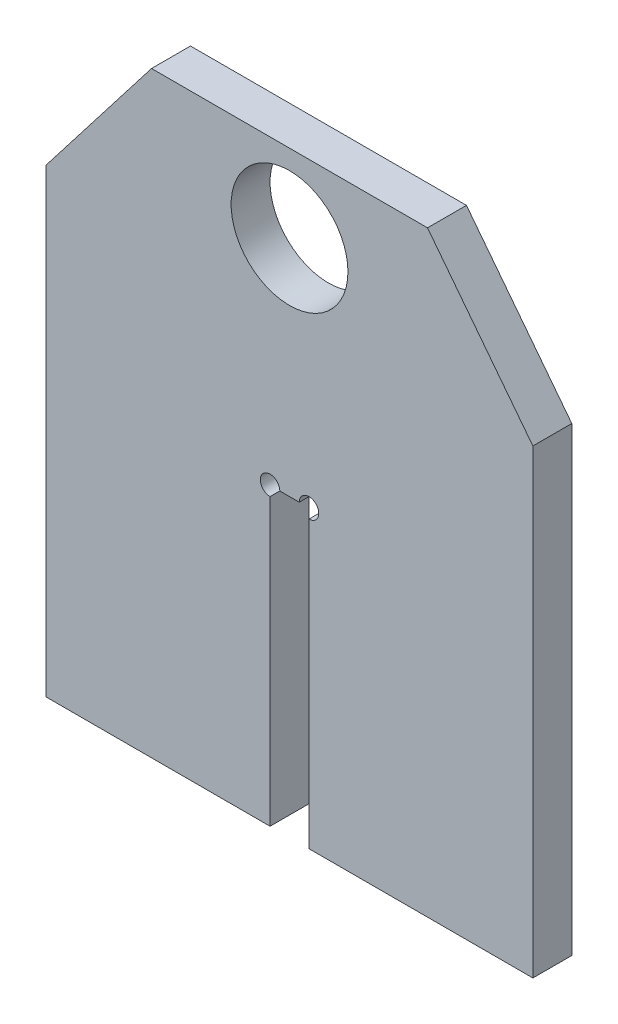
ISO-10303-21;
HEADER;
FILE_DESCRIPTION(('STEP AP214'),'2;1');
FILE_NAME('part.step','',(''),(''),'','','');
FILE_SCHEMA(('AUTOMOTIVE_DESIGN { 1 0 10303 214 1 1 1 1 }'));
ENDSEC;
DATA;
#1=APPLICATION_CONTEXT('core data for automotive mechanical design processes');
#2=APPLICATION_PROTOCOL_DEFINITION('international standard','automotive_design',2000,#1);
#3=PRODUCT_CONTEXT('',#1,'mechanical');
#4=PRODUCT('Part','Part','',(#3));
#5=PRODUCT_RELATED_PRODUCT_CATEGORY('part','',(#4));
#6=PRODUCT_DEFINITION_FORMATION('','',#4);
#7=PRODUCT_DEFINITION_CONTEXT('part definition',#1,'design');
#8=PRODUCT_DEFINITION('design','',#6,#7);
#9=PRODUCT_DEFINITION_SHAPE('','',#8);
#10=(LENGTH_UNIT() NAMED_UNIT(*) SI_UNIT(.MILLI.,.METRE.));
#11=(NAMED_UNIT(*) PLANE_ANGLE_UNIT() SI_UNIT($,.RADIAN.));
#12=(NAMED_UNIT(*) SI_UNIT($,.STERADIAN.) SOLID_ANGLE_UNIT());
#13=UNCERTAINTY_MEASURE_WITH_UNIT(LENGTH_MEASURE(1.E-05),#10,'distance_accuracy_value','');
#14=(GEOMETRIC_REPRESENTATION_CONTEXT(3) GLOBAL_UNCERTAINTY_ASSIGNED_CONTEXT((#13)) GLOBAL_UNIT_ASSIGNED_CONTEXT((#10,
#11,#12)) REPRESENTATION_CONTEXT('',''));
#15=CARTESIAN_POINT('',(0.,0.,0.));
#16=DIRECTION('',(0.,0.,1.));
#17=DIRECTION('',(1.,0.,0.));
#18=AXIS2_PLACEMENT_3D('',#15,#16,#17);
#19=CARTESIAN_POINT('',(-3.,-34.5,6.));
#20=DIRECTION('',(0.,0.,1.));
#21=DIRECTION('',(1.,0.,0.));
#22=AXIS2_PLACEMENT_3D('',#19,#20,#21);
#23=PLANE('',#22);
#24=DIRECTION('',(1.,0.,0.));
#25=VECTOR('',#24,1.);
#26=CARTESIAN_POINT('',(3.00000000000002,-80.,6.));
#27=LINE('',#26,#25);
#28=CARTESIAN_POINT('',(3.00000000000002,-80.,6.));
#29=VERTEX_POINT('',#28);
#30=CARTESIAN_POINT('',(37.5,-80.,6.));
#31=VERTEX_POINT('',#30);
#32=EDGE_CURVE('E177',#29,#31,#27,.T.);
#33=ORIENTED_EDGE('',*,*,#32,.T.);
#34=DIRECTION('',(0.,1.,0.));
#35=VECTOR('',#34,1.);
#36=CARTESIAN_POINT('',(37.5,-9.,6.));
#37=LINE('',#36,#35);
#38=CARTESIAN_POINT('',(37.5,-9.,6.));
#39=VERTEX_POINT('',#38);
#40=EDGE_CURVE('E105',#31,#39,#37,.T.);
#41=ORIENTED_EDGE('',*,*,#40,.T.);
#42=DIRECTION('',(-0.611618619682889,0.791152743822075,0.));
#43=VECTOR('',#42,1.);
#44=CARTESIAN_POINT('',(37.5,-9.,6.));
#45=LINE('',#44,#43);
#46=CARTESIAN_POINT('',(21.265472453156,12.,6.));
#47=VERTEX_POINT('',#46);
#48=EDGE_CURVE('E204',#39,#47,#45,.T.);
#49=ORIENTED_EDGE('',*,*,#48,.T.);
#50=DIRECTION('',(-1.,0.,0.));
#51=VECTOR('',#50,1.);
#52=CARTESIAN_POINT('',(-21.265472453156,12.,6.));
#53=LINE('',#52,#51);
#54=CARTESIAN_POINT('',(-21.265472453156,12.,6.));
#55=VERTEX_POINT('',#54);
#56=EDGE_CURVE('E223',#47,#55,#53,.T.);
#57=ORIENTED_EDGE('',*,*,#56,.T.);
#58=DIRECTION('',(-0.611618619682889,-0.791152743822075,0.));
#59=VECTOR('',#58,1.);
#60=CARTESIAN_POINT('',(-37.5,-9.00000000000001,6.));
#61=LINE('',#60,#59);
#62=CARTESIAN_POINT('',(-37.5,-9.00000000000001,6.));
#63=VERTEX_POINT('',#62);
#64=EDGE_CURVE('E220',#55,#63,#61,.T.);
#65=ORIENTED_EDGE('',*,*,#64,.T.);
#66=DIRECTION('',(0.,-1.,0.));
#67=VECTOR('',#66,1.);
#68=CARTESIAN_POINT('',(-37.5,-9.00000000000001,6.));
#69=LINE('',#68,#67);
#70=CARTESIAN_POINT('',(-37.5,-80.,6.));
#71=VERTEX_POINT('',#70);
#72=EDGE_CURVE('E222',#63,#71,#69,.T.);
#73=ORIENTED_EDGE('',*,*,#72,.T.);
#74=DIRECTION('',(1.,0.,0.));
#75=VECTOR('',#74,1.);
#76=CARTESIAN_POINT('',(-37.5,-80.,6.));
#77=LINE('',#76,#75);
#78=CARTESIAN_POINT('',(-3.,-80.,6.));
#79=VERTEX_POINT('',#78);
#80=EDGE_CURVE('E225',#71,#79,#77,.T.);
#81=ORIENTED_EDGE('',*,*,#80,.T.);
#82=DIRECTION('',(0.,1.,0.));
#83=VECTOR('',#82,1.);
#84=CARTESIAN_POINT('',(-3.,-80.,6.));
#85=LINE('',#84,#83);
#86=CARTESIAN_POINT('',(-3.,-36.,6.));
#87=VERTEX_POINT('',#86);
#88=EDGE_CURVE('E231',#79,#87,#85,.T.);
#89=ORIENTED_EDGE('',*,*,#88,.T.);
#90=CARTESIAN_POINT('',(-3.,-34.5,6.));
#91=DIRECTION('',(0.,0.,-1.));
#92=DIRECTION('',(1.,0.,0.));
#93=AXIS2_PLACEMENT_3D('',#90,#91,#92);
#94=CIRCLE('',#93,1.5);
#95=CARTESIAN_POINT('',(-1.5,-34.5,6.));
#96=VERTEX_POINT('',#95);
#97=EDGE_CURVE('E136',#87,#96,#94,.T.);
#98=ORIENTED_EDGE('',*,*,#97,.T.);
#99=DIRECTION('',(1.,0.,0.));
#100=VECTOR('',#99,1.);
#101=CARTESIAN_POINT('',(1.5,-34.5,6.));
#102=LINE('',#101,#100);
#103=CARTESIAN_POINT('',(1.5,-34.5,6.));
#104=VERTEX_POINT('',#103);
#105=EDGE_CURVE('E130',#96,#104,#102,.T.);
#106=ORIENTED_EDGE('',*,*,#105,.T.);
#107=CARTESIAN_POINT('',(3.,-34.5,6.));
#108=DIRECTION('',(0.,0.,-1.));
#109=DIRECTION('',(1.,0.,0.));
#110=AXIS2_PLACEMENT_3D('',#107,#108,#109);
#111=CIRCLE('',#110,1.5);
#112=CARTESIAN_POINT('',(3.,-36.,6.));
#113=VERTEX_POINT('',#112);
#114=EDGE_CURVE('E134',#104,#113,#111,.T.);
#115=ORIENTED_EDGE('',*,*,#114,.T.);
#116=DIRECTION('',(0.,-1.,0.));
#117=VECTOR('',#116,1.);
#118=CARTESIAN_POINT('',(3.00000000000002,-80.,6.));
#119=LINE('',#118,#117);
#120=EDGE_CURVE('E50',#113,#29,#119,.T.);
#121=ORIENTED_EDGE('',*,*,#120,.T.);
#122=EDGE_LOOP('',(#33,#41,#49,#57,#65,#73,#81,#89,#98,#106,#115,#121));
#123=FACE_BOUND('',#122,.T.);
#124=CARTESIAN_POINT('',(0.,0.,6.));
#125=DIRECTION('',(0.,0.,1.));
#126=DIRECTION('',(1.,0.,0.));
#127=AXIS2_PLACEMENT_3D('',#124,#125,#126);
#128=CIRCLE('',#127,9.);
#129=CARTESIAN_POINT('',(9.,0.,6.));
#130=VERTEX_POINT('',#129);
#131=EDGE_CURVE('E158',#130,#130,#128,.T.);
#132=ORIENTED_EDGE('',*,*,#131,.F.);
#133=EDGE_LOOP('',(#132));
#134=FACE_BOUND('',#133,.T.);
#135=ADVANCED_FACE('F33',(#123,#134),#23,.T.);
#136=CARTESIAN_POINT('',(-3.,-34.5,0.));
#137=DIRECTION('',(0.,0.,1.));
#138=DIRECTION('',(1.,0.,0.));
#139=AXIS2_PLACEMENT_3D('',#136,#137,#138);
#140=PLANE('',#139);
#141=DIRECTION('',(1.,0.,0.));
#142=VECTOR('',#141,1.);
#143=CARTESIAN_POINT('',(3.00000000000002,-80.,0.));
#144=LINE('',#143,#142);
#145=CARTESIAN_POINT('',(3.00000000000002,-80.,0.));
#146=VERTEX_POINT('',#145);
#147=CARTESIAN_POINT('',(37.5,-80.,0.));
#148=VERTEX_POINT('',#147);
#149=EDGE_CURVE('E154',#146,#148,#144,.T.);
#150=ORIENTED_EDGE('',*,*,#149,.F.);
#151=DIRECTION('',(0.,-1.,0.));
#152=VECTOR('',#151,1.);
#153=CARTESIAN_POINT('',(3.00000000000002,-80.,0.));
#154=LINE('',#153,#152);
#155=CARTESIAN_POINT('',(3.,-36.,0.));
#156=VERTEX_POINT('',#155);
#157=EDGE_CURVE('E97',#156,#146,#154,.T.);
#158=ORIENTED_EDGE('',*,*,#157,.F.);
#159=CARTESIAN_POINT('',(3.,-34.5,0.));
#160=DIRECTION('',(0.,0.,-1.));
#161=DIRECTION('',(1.,0.,0.));
#162=AXIS2_PLACEMENT_3D('',#159,#160,#161);
#163=CIRCLE('',#162,1.5);
#164=CARTESIAN_POINT('',(1.5,-34.5,0.));
#165=VERTEX_POINT('',#164);
#166=EDGE_CURVE('E91',#165,#156,#163,.T.);
#167=ORIENTED_EDGE('',*,*,#166,.F.);
#168=DIRECTION('',(1.,0.,0.));
#169=VECTOR('',#168,1.);
#170=CARTESIAN_POINT('',(1.5,-34.5,0.));
#171=LINE('',#170,#169);
#172=CARTESIAN_POINT('',(-1.5,-34.5,0.));
#173=VERTEX_POINT('',#172);
#174=EDGE_CURVE('E144',#173,#165,#171,.T.);
#175=ORIENTED_EDGE('',*,*,#174,.F.);
#176=CARTESIAN_POINT('',(-3.,-34.5,0.));
#177=DIRECTION('',(0.,0.,-1.));
#178=DIRECTION('',(1.,0.,0.));
#179=AXIS2_PLACEMENT_3D('',#176,#177,#178);
#180=CIRCLE('',#179,1.5);
#181=CARTESIAN_POINT('',(-3.,-36.,0.));
#182=VERTEX_POINT('',#181);
#183=EDGE_CURVE('E172',#182,#173,#180,.T.);
#184=ORIENTED_EDGE('',*,*,#183,.F.);
#185=DIRECTION('',(0.,1.,0.));
#186=VECTOR('',#185,1.);
#187=CARTESIAN_POINT('',(-3.,-80.,0.));
#188=LINE('',#187,#186);
#189=CARTESIAN_POINT('',(-3.,-80.,0.));
#190=VERTEX_POINT('',#189);
#191=EDGE_CURVE('E170',#190,#182,#188,.T.);
#192=ORIENTED_EDGE('',*,*,#191,.F.);
#193=DIRECTION('',(1.,0.,0.));
#194=VECTOR('',#193,1.);
#195=CARTESIAN_POINT('',(-37.5,-80.,0.));
#196=LINE('',#195,#194);
#197=CARTESIAN_POINT('',(-37.5,-80.,0.));
#198=VERTEX_POINT('',#197);
#199=EDGE_CURVE('E168',#198,#190,#196,.T.);
#200=ORIENTED_EDGE('',*,*,#199,.F.);
#201=DIRECTION('',(0.,-1.,0.));
#202=VECTOR('',#201,1.);
#203=CARTESIAN_POINT('',(-37.5,-9.00000000000001,0.));
#204=LINE('',#203,#202);
#205=CARTESIAN_POINT('',(-37.5,-9.00000000000001,0.));
#206=VERTEX_POINT('',#205);
#207=EDGE_CURVE('E166',#206,#198,#204,.T.);
#208=ORIENTED_EDGE('',*,*,#207,.F.);
#209=DIRECTION('',(-0.611618619682889,-0.791152743822075,0.));
#210=VECTOR('',#209,1.);
#211=CARTESIAN_POINT('',(-37.5,-9.00000000000001,0.));
#212=LINE('',#211,#210);
#213=CARTESIAN_POINT('',(-21.265472453156,12.,0.));
#214=VERTEX_POINT('',#213);
#215=EDGE_CURVE('E164',#214,#206,#212,.T.);
#216=ORIENTED_EDGE('',*,*,#215,.F.);
#217=DIRECTION('',(-1.,0.,0.));
#218=VECTOR('',#217,1.);
#219=CARTESIAN_POINT('',(-21.265472453156,12.,0.));
#220=LINE('',#219,#218);
#221=CARTESIAN_POINT('',(21.265472453156,12.,0.));
#222=VERTEX_POINT('',#221);
#223=EDGE_CURVE('E162',#222,#214,#220,.T.);
#224=ORIENTED_EDGE('',*,*,#223,.F.);
#225=DIRECTION('',(-0.611618619682889,0.791152743822075,0.));
#226=VECTOR('',#225,1.);
#227=CARTESIAN_POINT('',(37.5,-9.,0.));
#228=LINE('',#227,#226);
#229=CARTESIAN_POINT('',(37.5,-9.,0.));
#230=VERTEX_POINT('',#229);
#231=EDGE_CURVE('E160',#230,#222,#228,.T.);
#232=ORIENTED_EDGE('',*,*,#231,.F.);
#233=DIRECTION('',(0.,1.,0.));
#234=VECTOR('',#233,1.);
#235=CARTESIAN_POINT('',(37.5,-9.,0.));
#236=LINE('',#235,#234);
#237=EDGE_CURVE('E157',#148,#230,#236,.T.);
#238=ORIENTED_EDGE('',*,*,#237,.F.);
#239=EDGE_LOOP('',(#150,#158,#167,#175,#184,#192,#200,#208,#216,#224,#232,#238));
#240=FACE_BOUND('',#239,.T.);
#241=CARTESIAN_POINT('',(0.,0.,0.));
#242=DIRECTION('',(0.,0.,1.));
#243=DIRECTION('',(1.,0.,0.));
#244=AXIS2_PLACEMENT_3D('',#241,#242,#243);
#245=CIRCLE('',#244,9.);
#246=CARTESIAN_POINT('',(9.,0.,0.));
#247=VERTEX_POINT('',#246);
#248=EDGE_CURVE('E378',#247,#247,#245,.T.);
#249=ORIENTED_EDGE('',*,*,#248,.T.);
#250=EDGE_LOOP('',(#249));
#251=FACE_BOUND('',#250,.T.);
#252=ADVANCED_FACE('F208',(#240,#251),#140,.F.);
#253=CARTESIAN_POINT('',(3.00000000000002,-80.,6.));
#254=DIRECTION('',(0.,1.,0.));
#255=DIRECTION('',(0.,0.,1.));
#256=AXIS2_PLACEMENT_3D('',#253,#254,#255);
#257=PLANE('',#256);
#258=ORIENTED_EDGE('',*,*,#149,.T.);
#259=DIRECTION('',(0.,0.,-1.));
#260=VECTOR('',#259,1.);
#261=CARTESIAN_POINT('',(37.5,-80.,6.));
#262=LINE('',#261,#260);
#263=EDGE_CURVE('E11',#31,#148,#262,.T.);
#264=ORIENTED_EDGE('',*,*,#263,.F.);
#265=ORIENTED_EDGE('',*,*,#32,.F.);
#266=DIRECTION('',(0.,0.,-1.));
#267=VECTOR('',#266,1.);
#268=CARTESIAN_POINT('',(3.00000000000002,-80.,6.));
#269=LINE('',#268,#267);
#270=EDGE_CURVE('E150',#29,#146,#269,.T.);
#271=ORIENTED_EDGE('',*,*,#270,.T.);
#272=EDGE_LOOP('',(#258,#264,#265,#271));
#273=FACE_BOUND('',#272,.T.);
#274=ADVANCED_FACE('F35',(#273),#257,.F.);
#275=CARTESIAN_POINT('',(37.5,-9.,6.));
#276=DIRECTION('',(-1.,0.,0.));
#277=DIRECTION('',(0.,-1.,0.));
#278=AXIS2_PLACEMENT_3D('',#275,#276,#277);
#279=PLANE('',#278);
#280=ORIENTED_EDGE('',*,*,#237,.T.);
#281=DIRECTION('',(0.,0.,-1.));
#282=VECTOR('',#281,1.);
#283=CARTESIAN_POINT('',(37.5,-9.,6.));
#284=LINE('',#283,#282);
#285=EDGE_CURVE('E42',#39,#230,#284,.T.);
#286=ORIENTED_EDGE('',*,*,#285,.F.);
#287=ORIENTED_EDGE('',*,*,#40,.F.);
#288=ORIENTED_EDGE('',*,*,#263,.T.);
#289=EDGE_LOOP('',(#280,#286,#287,#288));
#290=FACE_BOUND('',#289,.T.);
#291=ADVANCED_FACE('F265',(#290),#279,.F.);
#292=CARTESIAN_POINT('',(37.5,-9.,6.));
#293=DIRECTION('',(-0.791152743822075,-0.611618619682889,0.));
#294=DIRECTION('',(0.611618619682889,-0.791152743822075,0.));
#295=AXIS2_PLACEMENT_3D('',#292,#293,#294);
#296=PLANE('',#295);
#297=ORIENTED_EDGE('',*,*,#231,.T.);
#298=DIRECTION('',(0.,0.,-1.));
#299=VECTOR('',#298,1.);
#300=CARTESIAN_POINT('',(21.265472453156,12.,6.));
#301=LINE('',#300,#299);
#302=EDGE_CURVE('E196',#47,#222,#301,.T.);
#303=ORIENTED_EDGE('',*,*,#302,.F.);
#304=ORIENTED_EDGE('',*,*,#48,.F.);
#305=ORIENTED_EDGE('',*,*,#285,.T.);
#306=EDGE_LOOP('',(#297,#303,#304,#305));
#307=FACE_BOUND('',#306,.T.);
#308=ADVANCED_FACE('F202',(#307),#296,.F.);
#309=CARTESIAN_POINT('',(-21.265472453156,12.,6.));
#310=DIRECTION('',(0.,-1.,0.));
#311=DIRECTION('',(1.,0.,0.));
#312=AXIS2_PLACEMENT_3D('',#309,#310,#311);
#313=PLANE('',#312);
#314=ORIENTED_EDGE('',*,*,#223,.T.);
#315=DIRECTION('',(0.,0.,-1.));
#316=VECTOR('',#315,1.);
#317=CARTESIAN_POINT('',(-21.265472453156,12.,6.));
#318=LINE('',#317,#316);
#319=EDGE_CURVE('E193',#55,#214,#318,.T.);
#320=ORIENTED_EDGE('',*,*,#319,.F.);
#321=ORIENTED_EDGE('',*,*,#56,.F.);
#322=ORIENTED_EDGE('',*,*,#302,.T.);
#323=EDGE_LOOP('',(#314,#320,#321,#322));
#324=FACE_BOUND('',#323,.T.);
#325=ADVANCED_FACE('F214',(#324),#313,.F.);
#326=CARTESIAN_POINT('',(-37.5,-9.00000000000001,6.));
#327=DIRECTION('',(0.791152743822075,-0.611618619682889,0.));
#328=DIRECTION('',(0.611618619682889,0.791152743822075,0.));
#329=AXIS2_PLACEMENT_3D('',#326,#327,#328);
#330=PLANE('',#329);
#331=ORIENTED_EDGE('',*,*,#215,.T.);
#332=DIRECTION('',(0.,0.,-1.));
#333=VECTOR('',#332,1.);
#334=CARTESIAN_POINT('',(-37.5,-9.00000000000001,6.));
#335=LINE('',#334,#333);
#336=EDGE_CURVE('E190',#63,#206,#335,.T.);
#337=ORIENTED_EDGE('',*,*,#336,.F.);
#338=ORIENTED_EDGE('',*,*,#64,.F.);
#339=ORIENTED_EDGE('',*,*,#319,.T.);
#340=EDGE_LOOP('',(#331,#337,#338,#339));
#341=FACE_BOUND('',#340,.T.);
#342=ADVANCED_FACE('F218',(#341),#330,.F.);
#343=CARTESIAN_POINT('',(-37.5,-9.00000000000001,6.));
#344=DIRECTION('',(1.,0.,0.));
#345=DIRECTION('',(0.,1.,0.));
#346=AXIS2_PLACEMENT_3D('',#343,#344,#345);
#347=PLANE('',#346);
#348=ORIENTED_EDGE('',*,*,#207,.T.);
#349=DIRECTION('',(0.,0.,-1.));
#350=VECTOR('',#349,1.);
#351=CARTESIAN_POINT('',(-37.5,-80.,6.));
#352=LINE('',#351,#350);
#353=EDGE_CURVE('E187',#71,#198,#352,.T.);
#354=ORIENTED_EDGE('',*,*,#353,.F.);
#355=ORIENTED_EDGE('',*,*,#72,.F.);
#356=ORIENTED_EDGE('',*,*,#336,.T.);
#357=EDGE_LOOP('',(#348,#354,#355,#356));
#358=FACE_BOUND('',#357,.T.);
#359=ADVANCED_FACE('F278',(#358),#347,.F.);
#360=CARTESIAN_POINT('',(-37.5,-80.,6.));
#361=DIRECTION('',(0.,1.,0.));
#362=DIRECTION('',(-1.,0.,0.));
#363=AXIS2_PLACEMENT_3D('',#360,#361,#362);
#364=PLANE('',#363);
#365=ORIENTED_EDGE('',*,*,#199,.T.);
#366=DIRECTION('',(0.,0.,-1.));
#367=VECTOR('',#366,1.);
#368=CARTESIAN_POINT('',(-3.,-80.,6.));
#369=LINE('',#368,#367);
#370=EDGE_CURVE('E184',#79,#190,#369,.T.);
#371=ORIENTED_EDGE('',*,*,#370,.F.);
#372=ORIENTED_EDGE('',*,*,#80,.F.);
#373=ORIENTED_EDGE('',*,*,#353,.T.);
#374=EDGE_LOOP('',(#365,#371,#372,#373));
#375=FACE_BOUND('',#374,.T.);
#376=ADVANCED_FACE('F281',(#375),#364,.F.);
#377=CARTESIAN_POINT('',(-3.,-80.,6.));
#378=DIRECTION('',(-1.,0.,0.));
#379=DIRECTION('',(0.,-1.,0.));
#380=AXIS2_PLACEMENT_3D('',#377,#378,#379);
#381=PLANE('',#380);
#382=ORIENTED_EDGE('',*,*,#191,.T.);
#383=DIRECTION('',(0.,0.,-1.));
#384=VECTOR('',#383,1.);
#385=CARTESIAN_POINT('',(-3.,-36.,6.));
#386=LINE('',#385,#384);
#387=EDGE_CURVE('E181',#87,#182,#386,.T.);
#388=ORIENTED_EDGE('',*,*,#387,.F.);
#389=ORIENTED_EDGE('',*,*,#88,.F.);
#390=ORIENTED_EDGE('',*,*,#370,.T.);
#391=EDGE_LOOP('',(#382,#388,#389,#390));
#392=FACE_BOUND('',#391,.T.);
#393=ADVANCED_FACE('F237',(#392),#381,.F.);
#394=CARTESIAN_POINT('',(-3.,-34.5,6.));
#395=DIRECTION('',(0.,0.,-1.));
#396=DIRECTION('',(-1.,0.,0.));
#397=AXIS2_PLACEMENT_3D('',#394,#395,#396);
#398=CYLINDRICAL_SURFACE('',#397,1.5);
#399=ORIENTED_EDGE('',*,*,#183,.T.);
#400=DIRECTION('',(0.,0.,-1.));
#401=VECTOR('',#400,1.);
#402=CARTESIAN_POINT('',(-1.5,-34.5,6.));
#403=LINE('',#402,#401);
#404=EDGE_CURVE('E145',#96,#173,#403,.T.);
#405=ORIENTED_EDGE('',*,*,#404,.F.);
#406=ORIENTED_EDGE('',*,*,#97,.F.);
#407=ORIENTED_EDGE('',*,*,#387,.T.);
#408=EDGE_LOOP('',(#399,#405,#406,#407));
#409=FACE_BOUND('',#408,.T.);
#410=ADVANCED_FACE('F241',(#409),#398,.F.);
#411=CARTESIAN_POINT('',(1.5,-34.5,6.));
#412=DIRECTION('',(0.,1.,0.));
#413=DIRECTION('',(-1.,0.,0.));
#414=AXIS2_PLACEMENT_3D('',#411,#412,#413);
#415=PLANE('',#414);
#416=ORIENTED_EDGE('',*,*,#174,.T.);
#417=DIRECTION('',(0.,0.,-1.));
#418=VECTOR('',#417,1.);
#419=CARTESIAN_POINT('',(1.5,-34.5,6.));
#420=LINE('',#419,#418);
#421=EDGE_CURVE('E141',#104,#165,#420,.T.);
#422=ORIENTED_EDGE('',*,*,#421,.F.);
#423=ORIENTED_EDGE('',*,*,#105,.F.);
#424=ORIENTED_EDGE('',*,*,#404,.T.);
#425=EDGE_LOOP('',(#416,#422,#423,#424));
#426=FACE_BOUND('',#425,.T.);
#427=ADVANCED_FACE('F142',(#426),#415,.F.);
#428=CARTESIAN_POINT('',(3.,-34.5,6.));
#429=DIRECTION('',(0.,0.,-1.));
#430=DIRECTION('',(-1.,0.,0.));
#431=AXIS2_PLACEMENT_3D('',#428,#429,#430);
#432=CYLINDRICAL_SURFACE('',#431,1.5);
#433=ORIENTED_EDGE('',*,*,#166,.T.);
#434=DIRECTION('',(0.,0.,-1.));
#435=VECTOR('',#434,1.);
#436=CARTESIAN_POINT('',(3.,-36.,6.));
#437=LINE('',#436,#435);
#438=EDGE_CURVE('E146',#113,#156,#437,.T.);
#439=ORIENTED_EDGE('',*,*,#438,.F.);
#440=ORIENTED_EDGE('',*,*,#114,.F.);
#441=ORIENTED_EDGE('',*,*,#421,.T.);
#442=EDGE_LOOP('',(#433,#439,#440,#441));
#443=FACE_BOUND('',#442,.T.);
#444=ADVANCED_FACE('F148',(#443),#432,.F.);
#445=CARTESIAN_POINT('',(3.00000000000002,-80.,6.));
#446=DIRECTION('',(1.,0.,0.));
#447=DIRECTION('',(0.,1.,0.));
#448=AXIS2_PLACEMENT_3D('',#445,#446,#447);
#449=PLANE('',#448);
#450=ORIENTED_EDGE('',*,*,#157,.T.);
#451=ORIENTED_EDGE('',*,*,#270,.F.);
#452=ORIENTED_EDGE('',*,*,#120,.F.);
#453=ORIENTED_EDGE('',*,*,#438,.T.);
#454=EDGE_LOOP('',(#450,#451,#452,#453));
#455=FACE_BOUND('',#454,.T.);
#456=ADVANCED_FACE('F245',(#455),#449,.F.);
#457=CARTESIAN_POINT('',(0.,0.,6.));
#458=DIRECTION('',(0.,0.,-1.));
#459=DIRECTION('',(-1.,0.,0.));
#460=AXIS2_PLACEMENT_3D('',#457,#458,#459);
#461=CYLINDRICAL_SURFACE('',#460,9.);
#462=ORIENTED_EDGE('',*,*,#131,.T.);
#463=EDGE_LOOP('',(#462));
#464=FACE_BOUND('',#463,.T.);
#465=ORIENTED_EDGE('',*,*,#248,.F.);
#466=EDGE_LOOP('',(#465));
#467=FACE_BOUND('',#466,.T.);
#468=ADVANCED_FACE('F247',(#464,#467),#461,.F.);
#469=CLOSED_SHELL('',(#135,#252,#274,#291,#308,#325,#342,#359,#376,#393,#410,#427,#444,#456,#468));
#470=MANIFOLD_SOLID_BREP('B2',#469);
#471=ADVANCED_BREP_SHAPE_REPRESENTATION('',(#18,#470),#14);
#472=SHAPE_DEFINITION_REPRESENTATION(#9,#471);
ENDSEC;
END-ISO-10303-21;
